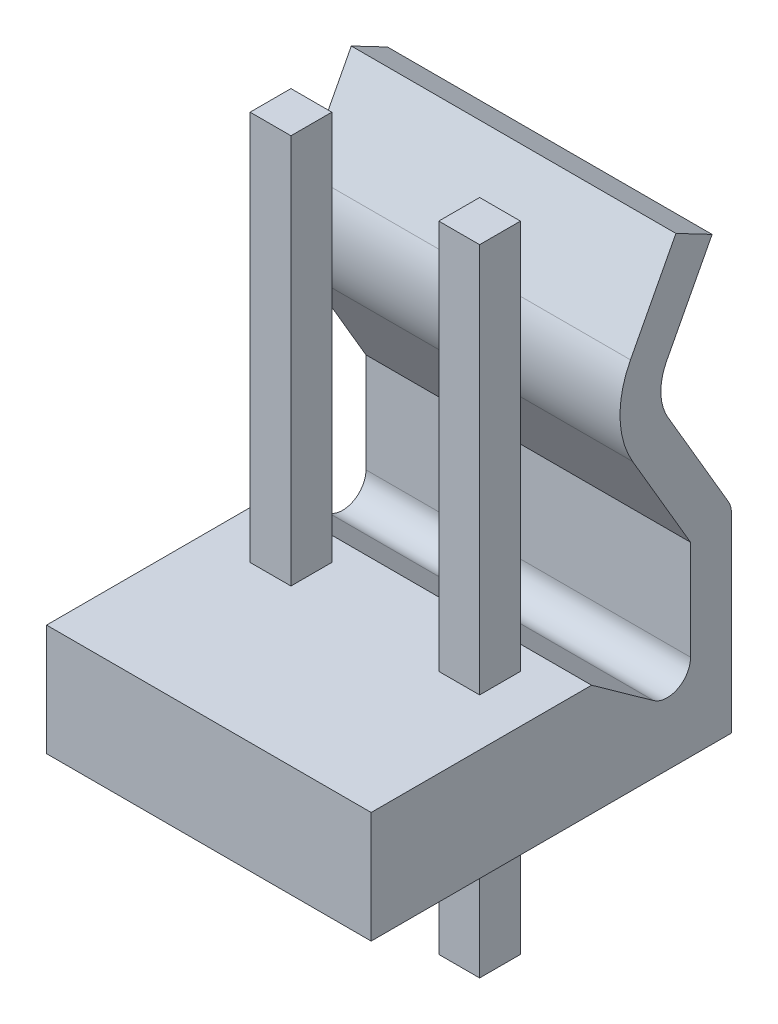
ISO-10303-21;
HEADER;
FILE_DESCRIPTION(('STEP AP214'),'2;1');
FILE_NAME('part.step','',(''),(''),'','','');
FILE_SCHEMA(('AUTOMOTIVE_DESIGN { 1 0 10303 214 1 1 1 1 }'));
ENDSEC;
DATA;
#1=APPLICATION_CONTEXT('core data for automotive mechanical design processes');
#2=APPLICATION_PROTOCOL_DEFINITION('international standard','automotive_design',2000,#1);
#3=PRODUCT_CONTEXT('',#1,'mechanical');
#4=PRODUCT('Part','Part','',(#3));
#5=PRODUCT_RELATED_PRODUCT_CATEGORY('part','',(#4));
#6=PRODUCT_DEFINITION_FORMATION('','',#4);
#7=PRODUCT_DEFINITION_CONTEXT('part definition',#1,'design');
#8=PRODUCT_DEFINITION('design','',#6,#7);
#9=PRODUCT_DEFINITION_SHAPE('','',#8);
#10=(LENGTH_UNIT() NAMED_UNIT(*) SI_UNIT(.MILLI.,.METRE.));
#11=(NAMED_UNIT(*) PLANE_ANGLE_UNIT() SI_UNIT($,.RADIAN.));
#12=(NAMED_UNIT(*) SI_UNIT($,.STERADIAN.) SOLID_ANGLE_UNIT());
#13=UNCERTAINTY_MEASURE_WITH_UNIT(LENGTH_MEASURE(1.E-05),#10,'distance_accuracy_value','');
#14=(GEOMETRIC_REPRESENTATION_CONTEXT(3) GLOBAL_UNCERTAINTY_ASSIGNED_CONTEXT((#13)) GLOBAL_UNIT_ASSIGNED_CONTEXT((#10,
#11,#12)) REPRESENTATION_CONTEXT('',''));
#15=CARTESIAN_POINT('',(0.,0.,0.));
#16=DIRECTION('',(0.,0.,1.));
#17=DIRECTION('',(1.,0.,0.));
#18=AXIS2_PLACEMENT_3D('',#15,#16,#17);
#19=CARTESIAN_POINT('',(-1.83,3.,4.75));
#20=DIRECTION('',(1.,0.,0.));
#21=DIRECTION('',(0.,0.,-1.));
#22=AXIS2_PLACEMENT_3D('',#19,#20,#21);
#23=PLANE('',#22);
#24=CARTESIAN_POINT('',(-1.83,8.91550890004947,-4.42538276181376));
#25=DIRECTION('',(-1.,0.,0.));
#26=DIRECTION('',(0.,0.,1.));
#27=AXIS2_PLACEMENT_3D('',#24,#25,#26);
#28=CIRCLE('',#27,2.47538276181376);
#29=CARTESIAN_POINT('',(-1.83,7.66445370084309,-2.28940975027466));
#30=VERTEX_POINT('',#29);
#31=CARTESIAN_POINT('',(-1.83,10.0634674155817,-2.23227741457167));
#32=VERTEX_POINT('',#31);
#33=EDGE_CURVE('E466',#30,#32,#28,.T.);
#34=ORIENTED_EDGE('',*,*,#33,.T.);
#35=DIRECTION('',(0.,-0.885966154840295,0.463749902940694));
#36=VECTOR('',#35,1.);
#37=CARTESIAN_POINT('',(-1.83,1.24712078359708,2.38254886579722));
#38=LINE('',#37,#36);
#39=CARTESIAN_POINT('',(-1.83,12.4,-3.45531144733007));
#40=VERTEX_POINT('',#39);
#41=EDGE_CURVE('E428',#40,#32,#38,.T.);
#42=ORIENTED_EDGE('',*,*,#41,.F.);
#43=DIRECTION('',(0.,-0.463749902940693,-0.885966154840295));
#44=VECTOR('',#43,1.);
#45=CARTESIAN_POINT('',(-1.83,11.1528792164029,-5.83786031312728));
#46=LINE('',#45,#44);
#47=CARTESIAN_POINT('',(-1.83,11.8898751067652,-4.42987421765439));
#48=VERTEX_POINT('',#47);
#49=EDGE_CURVE('E460',#40,#48,#46,.T.);
#50=ORIENTED_EDGE('',*,*,#49,.T.);
#51=DIRECTION('',(0.,-0.885966154840295,0.463749902940694));
#52=VECTOR('',#51,1.);
#53=CARTESIAN_POINT('',(-1.83,0.736995890362313,1.40798609547289));
#54=LINE('',#53,#52);
#55=CARTESIAN_POINT('',(-1.83,9.5533425223469,-3.206840184896));
#56=VERTEX_POINT('',#55);
#57=EDGE_CURVE('E457',#48,#56,#54,.T.);
#58=ORIENTED_EDGE('',*,*,#57,.T.);
#59=CARTESIAN_POINT('',(-1.83,8.91550890004947,-4.42538276181376));
#60=DIRECTION('',(-1.,0.,0.));
#61=DIRECTION('',(0.,0.,1.));
#62=AXIS2_PLACEMENT_3D('',#59,#60,#61);
#63=CIRCLE('',#62,1.37538276181376);
#64=CARTESIAN_POINT('',(-1.83,8.22039225723777,-3.23858429771775));
#65=VERTEX_POINT('',#64);
#66=EDGE_CURVE('E454',#65,#56,#63,.T.);
#67=ORIENTED_EDGE('',*,*,#66,.F.);
#68=DIRECTION('',(0.,-0.862885952220996,-0.505398687631523));
#69=VECTOR('',#68,1.);
#70=CARTESIAN_POINT('',(-1.83,3.51206822083145,-5.99628452776422));
#71=LINE('',#70,#69);
#72=CARTESIAN_POINT('',(-1.83,5.4429665684072,-4.86534307680788));
#73=VERTEX_POINT('',#72);
#74=EDGE_CURVE('E451',#65,#73,#71,.T.);
#75=ORIENTED_EDGE('',*,*,#74,.T.);
#76=CARTESIAN_POINT('',(-1.83,5.13092342933234,-4.33258023475049));
#77=DIRECTION('',(-1.,0.,0.));
#78=DIRECTION('',(0.,0.,1.));
#79=AXIS2_PLACEMENT_3D('',#76,#77,#78);
#80=CIRCLE('',#79,0.617419765249505);
#81=CARTESIAN_POINT('',(-1.83,5.13092342933234,-4.95));
#82=VERTEX_POINT('',#81);
#83=EDGE_CURVE('E448',#73,#82,#80,.T.);
#84=ORIENTED_EDGE('',*,*,#83,.T.);
#85=DIRECTION('',(0.,-1.,0.));
#86=VECTOR('',#85,1.);
#87=CARTESIAN_POINT('',(-1.83,3.,-4.95));
#88=LINE('',#87,#86);
#89=CARTESIAN_POINT('',(-1.83,0.,-4.95));
#90=VERTEX_POINT('',#89);
#91=EDGE_CURVE('E552',#82,#90,#88,.T.);
#92=ORIENTED_EDGE('',*,*,#91,.T.);
#93=DIRECTION('',(0.,0.,1.));
#94=VECTOR('',#93,1.);
#95=CARTESIAN_POINT('',(-1.83,0.,4.75));
#96=LINE('',#95,#94);
#97=CARTESIAN_POINT('',(-1.83,0.,4.75));
#98=VERTEX_POINT('',#97);
#99=EDGE_CURVE('E533',#90,#98,#96,.T.);
#100=ORIENTED_EDGE('',*,*,#99,.T.);
#101=DIRECTION('',(0.,-1.,0.));
#102=VECTOR('',#101,1.);
#103=CARTESIAN_POINT('',(-1.83,3.,4.75));
#104=LINE('',#103,#102);
#105=CARTESIAN_POINT('',(-1.83,3.,4.75));
#106=VERTEX_POINT('',#105);
#107=EDGE_CURVE('E568',#106,#98,#104,.T.);
#108=ORIENTED_EDGE('',*,*,#107,.F.);
#109=DIRECTION('',(0.,0.,1.));
#110=VECTOR('',#109,1.);
#111=CARTESIAN_POINT('',(-1.83,3.,4.75));
#112=LINE('',#111,#110);
#113=CARTESIAN_POINT('',(-1.83,3.,-1.18444451529598));
#114=VERTEX_POINT('',#113);
#115=EDGE_CURVE('E544',#114,#106,#112,.T.);
#116=ORIENTED_EDGE('',*,*,#115,.F.);
#117=DIRECTION('',(0.,-0.581152715503747,-0.813794520295278));
#118=VECTOR('',#117,1.);
#119=CARTESIAN_POINT('',(-1.83,2.5469544444336,-1.8188491747399));
#120=LINE('',#119,#118);
#121=CARTESIAN_POINT('',(-1.83,1.80749793323204,-2.85431823607068));
#122=VERTEX_POINT('',#121);
#123=EDGE_CURVE('E484',#114,#122,#120,.T.);
#124=ORIENTED_EDGE('',*,*,#123,.T.);
#125=CARTESIAN_POINT('',(-1.83,2.31995973119661,-3.2202810903929));
#126=DIRECTION('',(-1.,0.,0.));
#127=DIRECTION('',(0.,0.,1.));
#128=AXIS2_PLACEMENT_3D('',#125,#126,#127);
#129=CIRCLE('',#128,0.629718909607097);
#130=CARTESIAN_POINT('',(-1.83,2.31995973119661,-3.85));
#131=VERTEX_POINT('',#130);
#132=EDGE_CURVE('E481',#131,#122,#129,.T.);
#133=ORIENTED_EDGE('',*,*,#132,.F.);
#134=DIRECTION('',(0.,1.,0.));
#135=VECTOR('',#134,1.);
#136=CARTESIAN_POINT('',(-1.83,0.,-3.85));
#137=LINE('',#136,#135);
#138=CARTESIAN_POINT('',(-1.83,5.,-3.85));
#139=VERTEX_POINT('',#138);
#140=EDGE_CURVE('E478',#131,#139,#137,.T.);
#141=ORIENTED_EDGE('',*,*,#140,.T.);
#142=DIRECTION('',(0.,0.862885952220995,0.505398687631523));
#143=VECTOR('',#142,1.);
#144=CARTESIAN_POINT('',(-1.83,2.95612966443678,-5.04710998032113));
#145=LINE('',#144,#143);
#146=EDGE_CURVE('E475',#139,#30,#145,.T.);
#147=ORIENTED_EDGE('',*,*,#146,.T.);
#148=EDGE_LOOP('',(#34,#42,#50,#58,#67,#75,#84,#92,#100,#108,#116,#124,#133,#141,#147));
#149=FACE_BOUND('',#148,.T.);
#150=ADVANCED_FACE('F146',(#149),#23,.F.);
#151=CARTESIAN_POINT('',(6.91,3.,-4.95));
#152=DIRECTION('',(-1.,0.,0.));
#153=DIRECTION('',(0.,0.,1.));
#154=AXIS2_PLACEMENT_3D('',#151,#152,#153);
#155=PLANE('',#154);
#156=DIRECTION('',(0.,-0.885966154840295,0.463749902940694));
#157=VECTOR('',#156,1.);
#158=CARTESIAN_POINT('',(6.91,5.63571912182841,0.085382047085799));
#159=LINE('',#158,#157);
#160=CARTESIAN_POINT('',(6.91,12.4,-3.45531144733007));
#161=VERTEX_POINT('',#160);
#162=CARTESIAN_POINT('',(6.91,10.0634674155817,-2.23227741457167));
#163=VERTEX_POINT('',#162);
#164=EDGE_CURVE('E445',#161,#163,#159,.T.);
#165=ORIENTED_EDGE('',*,*,#164,.T.);
#166=CARTESIAN_POINT('',(6.91,8.91550890004947,-4.42538276181376));
#167=DIRECTION('',(-1.,0.,0.));
#168=DIRECTION('',(0.,0.,1.));
#169=AXIS2_PLACEMENT_3D('',#166,#167,#168);
#170=CIRCLE('',#169,2.47538276181376);
#171=CARTESIAN_POINT('',(6.91,7.66445370084309,-2.28940975027466));
#172=VERTEX_POINT('',#171);
#173=EDGE_CURVE('E500',#172,#163,#170,.T.);
#174=ORIENTED_EDGE('',*,*,#173,.F.);
#175=DIRECTION('',(0.,0.862885952220995,0.505398687631523));
#176=VECTOR('',#175,1.);
#177=CARTESIAN_POINT('',(6.91,3.03114409630835,-5.00317347246197));
#178=LINE('',#177,#176);
#179=CARTESIAN_POINT('',(6.91,5.,-3.85));
#180=VERTEX_POINT('',#179);
#181=EDGE_CURVE('E573',#180,#172,#178,.T.);
#182=ORIENTED_EDGE('',*,*,#181,.F.);
#183=DIRECTION('',(0.,1.,0.));
#184=VECTOR('',#183,1.);
#185=CARTESIAN_POINT('',(6.91,3.,-3.85));
#186=LINE('',#185,#184);
#187=CARTESIAN_POINT('',(6.91,2.31995973119661,-3.85));
#188=VERTEX_POINT('',#187);
#189=EDGE_CURVE('E575',#188,#180,#186,.T.);
#190=ORIENTED_EDGE('',*,*,#189,.F.);
#191=CARTESIAN_POINT('',(6.91,2.31995973119661,-3.2202810903929));
#192=DIRECTION('',(-1.,0.,0.));
#193=DIRECTION('',(0.,0.,1.));
#194=AXIS2_PLACEMENT_3D('',#191,#192,#193);
#195=CIRCLE('',#194,0.629718909607097);
#196=CARTESIAN_POINT('',(6.91,1.80749793323204,-2.85431823607068));
#197=VERTEX_POINT('',#196);
#198=EDGE_CURVE('E577',#188,#197,#195,.T.);
#199=ORIENTED_EDGE('',*,*,#198,.T.);
#200=DIRECTION('',(0.,-0.581152715503746,-0.813794520295278));
#201=VECTOR('',#200,1.);
#202=CARTESIAN_POINT('',(6.91,1.21912234875397,-3.67822701899487));
#203=LINE('',#202,#201);
#204=CARTESIAN_POINT('',(6.91,3.,-1.18444451529598));
#205=VERTEX_POINT('',#204);
#206=EDGE_CURVE('E580',#205,#197,#203,.T.);
#207=ORIENTED_EDGE('',*,*,#206,.F.);
#208=DIRECTION('',(0.,0.,-1.));
#209=VECTOR('',#208,1.);
#210=CARTESIAN_POINT('',(6.91,3.,-4.95));
#211=LINE('',#210,#209);
#212=CARTESIAN_POINT('',(6.91,3.,4.75));
#213=VERTEX_POINT('',#212);
#214=EDGE_CURVE('E549',#213,#205,#211,.T.);
#215=ORIENTED_EDGE('',*,*,#214,.F.);
#216=DIRECTION('',(0.,-1.,0.));
#217=VECTOR('',#216,1.);
#218=CARTESIAN_POINT('',(6.91,3.,4.75));
#219=LINE('',#218,#217);
#220=CARTESIAN_POINT('',(6.91,0.,4.75));
#221=VERTEX_POINT('',#220);
#222=EDGE_CURVE('E565',#213,#221,#219,.T.);
#223=ORIENTED_EDGE('',*,*,#222,.T.);
#224=DIRECTION('',(0.,0.,-1.));
#225=VECTOR('',#224,1.);
#226=CARTESIAN_POINT('',(6.91,0.,-4.95));
#227=LINE('',#226,#225);
#228=CARTESIAN_POINT('',(6.91,0.,-4.95));
#229=VERTEX_POINT('',#228);
#230=EDGE_CURVE('E557',#221,#229,#227,.T.);
#231=ORIENTED_EDGE('',*,*,#230,.T.);
#232=DIRECTION('',(0.,-1.,0.));
#233=VECTOR('',#232,1.);
#234=CARTESIAN_POINT('',(6.91,3.,-4.95));
#235=LINE('',#234,#233);
#236=CARTESIAN_POINT('',(6.91,5.13092342933234,-4.95));
#237=VERTEX_POINT('',#236);
#238=EDGE_CURVE('E563',#237,#229,#235,.T.);
#239=ORIENTED_EDGE('',*,*,#238,.F.);
#240=CARTESIAN_POINT('',(6.91,5.13092342933234,-4.33258023475049));
#241=DIRECTION('',(-1.,0.,0.));
#242=DIRECTION('',(0.,0.,1.));
#243=AXIS2_PLACEMENT_3D('',#240,#241,#242);
#244=CIRCLE('',#243,0.617419765249505);
#245=CARTESIAN_POINT('',(6.91,5.4429665684072,-4.86534307680788));
#246=VERTEX_POINT('',#245);
#247=EDGE_CURVE('E502',#246,#237,#244,.T.);
#248=ORIENTED_EDGE('',*,*,#247,.F.);
#249=DIRECTION('',(0.,-0.862885952220996,-0.505398687631523));
#250=VECTOR('',#249,1.);
#251=CARTESIAN_POINT('',(6.91,3.58708265270302,-5.95234801990506));
#252=LINE('',#251,#250);
#253=CARTESIAN_POINT('',(6.91,8.22039225723777,-3.23858429771775));
#254=VERTEX_POINT('',#253);
#255=EDGE_CURVE('E582',#254,#246,#252,.T.);
#256=ORIENTED_EDGE('',*,*,#255,.F.);
#257=CARTESIAN_POINT('',(6.91,8.91550890004947,-4.42538276181376));
#258=DIRECTION('',(-1.,0.,0.));
#259=DIRECTION('',(0.,0.,1.));
#260=AXIS2_PLACEMENT_3D('',#257,#258,#259);
#261=CIRCLE('',#260,1.37538276181376);
#262=CARTESIAN_POINT('',(6.91,9.5533425223469,-3.206840184896));
#263=VERTEX_POINT('',#262);
#264=EDGE_CURVE('E153',#254,#263,#261,.T.);
#265=ORIENTED_EDGE('',*,*,#264,.T.);
#266=DIRECTION('',(0.,-0.885966154840295,0.463749902940694));
#267=VECTOR('',#266,1.);
#268=CARTESIAN_POINT('',(6.91,5.12559422859364,-0.889180723238528));
#269=LINE('',#268,#267);
#270=CARTESIAN_POINT('',(6.91,11.8898751067652,-4.42987421765439));
#271=VERTEX_POINT('',#270);
#272=EDGE_CURVE('E12',#271,#263,#269,.T.);
#273=ORIENTED_EDGE('',*,*,#272,.F.);
#274=DIRECTION('',(0.,-0.463749902940693,-0.885966154840295));
#275=VECTOR('',#274,1.);
#276=CARTESIAN_POINT('',(6.91,9.7642808781716,-8.49069349441586));
#277=LINE('',#276,#275);
#278=EDGE_CURVE('E491',#161,#271,#277,.T.);
#279=ORIENTED_EDGE('',*,*,#278,.F.);
#280=EDGE_LOOP('',(#165,#174,#182,#190,#199,#207,#215,#223,#231,#239,#248,#256,#265,#273,#279));
#281=FACE_BOUND('',#280,.T.);
#282=ADVANCED_FACE('F587',(#281),#155,.F.);
#283=CARTESIAN_POINT('',(0.,3.,0.));
#284=DIRECTION('',(0.,-1.,0.));
#285=DIRECTION('',(0.,0.,-1.));
#286=AXIS2_PLACEMENT_3D('',#283,#284,#285);
#287=PLANE('',#286);
#288=DIRECTION('',(0.,0.,-1.));
#289=VECTOR('',#288,1.);
#290=CARTESIAN_POINT('',(0.549999999999999,3.,0.550000000000001));
#291=LINE('',#290,#289);
#292=CARTESIAN_POINT('',(0.549999999999999,3.,0.550000000000001));
#293=VERTEX_POINT('',#292);
#294=CARTESIAN_POINT('',(0.549999999999993,3.,-0.549999999999999));
#295=VERTEX_POINT('',#294);
#296=EDGE_CURVE('E354',#293,#295,#291,.T.);
#297=ORIENTED_EDGE('',*,*,#296,.F.);
#298=DIRECTION('',(1.,0.,0.));
#299=VECTOR('',#298,1.);
#300=CARTESIAN_POINT('',(-0.550000000000001,3.,0.550000000000001));
#301=LINE('',#300,#299);
#302=CARTESIAN_POINT('',(-0.550000000000001,3.,0.550000000000001));
#303=VERTEX_POINT('',#302);
#304=EDGE_CURVE('E168',#303,#293,#301,.T.);
#305=ORIENTED_EDGE('',*,*,#304,.F.);
#306=DIRECTION('',(0.,0.,1.));
#307=VECTOR('',#306,1.);
#308=CARTESIAN_POINT('',(-0.550000000000001,3.,0.550000000000001));
#309=LINE('',#308,#307);
#310=CARTESIAN_POINT('',(-0.550000000000001,3.,-0.549999999999999));
#311=VERTEX_POINT('',#310);
#312=EDGE_CURVE('E530',#311,#303,#309,.T.);
#313=ORIENTED_EDGE('',*,*,#312,.F.);
#314=DIRECTION('',(-1.,0.,0.));
#315=VECTOR('',#314,1.);
#316=CARTESIAN_POINT('',(-0.550000000000001,3.,-0.549999999999999));
#317=LINE('',#316,#315);
#318=EDGE_CURVE('E527',#295,#311,#317,.T.);
#319=ORIENTED_EDGE('',*,*,#318,.F.);
#320=EDGE_LOOP('',(#297,#305,#313,#319));
#321=FACE_BOUND('',#320,.T.);
#322=DIRECTION('',(1.,0.,0.));
#323=VECTOR('',#322,1.);
#324=CARTESIAN_POINT('',(5.63,3.,0.550000000000001));
#325=LINE('',#324,#323);
#326=CARTESIAN_POINT('',(4.53,3.,0.550000000000001));
#327=VERTEX_POINT('',#326);
#328=CARTESIAN_POINT('',(5.63,3.,0.550000000000001));
#329=VERTEX_POINT('',#328);
#330=EDGE_CURVE('E505',#327,#329,#325,.T.);
#331=ORIENTED_EDGE('',*,*,#330,.F.);
#332=DIRECTION('',(0.,0.,1.));
#333=VECTOR('',#332,1.);
#334=CARTESIAN_POINT('',(4.53,3.,0.550000000000001));
#335=LINE('',#334,#333);
#336=CARTESIAN_POINT('',(4.53000000000001,3.,-0.549999999999999));
#337=VERTEX_POINT('',#336);
#338=EDGE_CURVE('E160',#337,#327,#335,.T.);
#339=ORIENTED_EDGE('',*,*,#338,.F.);
#340=DIRECTION('',(-1.,0.,0.));
#341=VECTOR('',#340,1.);
#342=CARTESIAN_POINT('',(5.63,3.,-0.549999999999999));
#343=LINE('',#342,#341);
#344=CARTESIAN_POINT('',(5.63,3.,-0.549999999999999));
#345=VERTEX_POINT('',#344);
#346=EDGE_CURVE('E512',#345,#337,#343,.T.);
#347=ORIENTED_EDGE('',*,*,#346,.F.);
#348=DIRECTION('',(0.,0.,-1.));
#349=VECTOR('',#348,1.);
#350=CARTESIAN_POINT('',(5.63,3.,0.550000000000001));
#351=LINE('',#350,#349);
#352=EDGE_CURVE('E508',#329,#345,#351,.T.);
#353=ORIENTED_EDGE('',*,*,#352,.F.);
#354=EDGE_LOOP('',(#331,#339,#347,#353));
#355=FACE_BOUND('',#354,.T.);
#356=DIRECTION('',(-1.,0.,0.));
#357=VECTOR('',#356,1.);
#358=CARTESIAN_POINT('',(7.17,3.,-1.18444451529598));
#359=LINE('',#358,#357);
#360=EDGE_CURVE('E488',#205,#114,#359,.T.);
#361=ORIENTED_EDGE('',*,*,#360,.T.);
#362=ORIENTED_EDGE('',*,*,#115,.T.);
#363=DIRECTION('',(1.,0.,0.));
#364=VECTOR('',#363,1.);
#365=CARTESIAN_POINT('',(6.91,3.,4.75));
#366=LINE('',#365,#364);
#367=EDGE_CURVE('E546',#106,#213,#366,.T.);
#368=ORIENTED_EDGE('',*,*,#367,.T.);
#369=ORIENTED_EDGE('',*,*,#214,.T.);
#370=EDGE_LOOP('',(#361,#362,#368,#369));
#371=FACE_BOUND('',#370,.T.);
#372=ADVANCED_FACE('F637',(#321,#355,#371),#287,.F.);
#373=CARTESIAN_POINT('',(-1.83,3.,-4.95));
#374=DIRECTION('',(0.,0.,1.));
#375=DIRECTION('',(1.,0.,0.));
#376=AXIS2_PLACEMENT_3D('',#373,#374,#375);
#377=PLANE('',#376);
#378=DIRECTION('',(-1.,0.,0.));
#379=VECTOR('',#378,1.);
#380=CARTESIAN_POINT('',(7.17,5.13092342933234,-4.95));
#381=LINE('',#380,#379);
#382=EDGE_CURVE('E464',#237,#82,#381,.T.);
#383=ORIENTED_EDGE('',*,*,#382,.F.);
#384=ORIENTED_EDGE('',*,*,#238,.T.);
#385=DIRECTION('',(-1.,0.,0.));
#386=VECTOR('',#385,1.);
#387=CARTESIAN_POINT('',(-1.83,0.,-4.95));
#388=LINE('',#387,#386);
#389=EDGE_CURVE('E547',#229,#90,#388,.T.);
#390=ORIENTED_EDGE('',*,*,#389,.T.);
#391=ORIENTED_EDGE('',*,*,#91,.F.);
#392=EDGE_LOOP('',(#383,#384,#390,#391));
#393=FACE_BOUND('',#392,.T.);
#394=ADVANCED_FACE('F654',(#393),#377,.F.);
#395=CARTESIAN_POINT('',(0.,0.,0.));
#396=DIRECTION('',(0.,-1.,0.));
#397=DIRECTION('',(0.,0.,-1.));
#398=AXIS2_PLACEMENT_3D('',#395,#396,#397);
#399=PLANE('',#398);
#400=ORIENTED_EDGE('',*,*,#99,.F.);
#401=ORIENTED_EDGE('',*,*,#389,.F.);
#402=ORIENTED_EDGE('',*,*,#230,.F.);
#403=DIRECTION('',(1.,0.,0.));
#404=VECTOR('',#403,1.);
#405=CARTESIAN_POINT('',(6.91,0.,4.75));
#406=LINE('',#405,#404);
#407=EDGE_CURVE('E555',#98,#221,#406,.T.);
#408=ORIENTED_EDGE('',*,*,#407,.F.);
#409=EDGE_LOOP('',(#400,#401,#402,#408));
#410=FACE_BOUND('',#409,.T.);
#411=DIRECTION('',(1.,0.,0.));
#412=VECTOR('',#411,1.);
#413=CARTESIAN_POINT('',(-0.550000000000001,0.,0.550000000000001));
#414=LINE('',#413,#412);
#415=CARTESIAN_POINT('',(-0.550000000000001,0.,0.550000000000001));
#416=VERTEX_POINT('',#415);
#417=CARTESIAN_POINT('',(0.549999999999999,0.,0.550000000000001));
#418=VERTEX_POINT('',#417);
#419=EDGE_CURVE('E528',#416,#418,#414,.T.);
#420=ORIENTED_EDGE('',*,*,#419,.T.);
#421=DIRECTION('',(0.,0.,-1.));
#422=VECTOR('',#421,1.);
#423=CARTESIAN_POINT('',(0.549999999999999,0.,0.550000000000001));
#424=LINE('',#423,#422);
#425=CARTESIAN_POINT('',(0.549999999999993,0.,-0.549999999999999));
#426=VERTEX_POINT('',#425);
#427=EDGE_CURVE('E515',#418,#426,#424,.T.);
#428=ORIENTED_EDGE('',*,*,#427,.T.);
#429=DIRECTION('',(-1.,0.,0.));
#430=VECTOR('',#429,1.);
#431=CARTESIAN_POINT('',(-0.550000000000001,0.,-0.549999999999999));
#432=LINE('',#431,#430);
#433=CARTESIAN_POINT('',(-0.550000000000001,0.,-0.549999999999999));
#434=VERTEX_POINT('',#433);
#435=EDGE_CURVE('E536',#426,#434,#432,.T.);
#436=ORIENTED_EDGE('',*,*,#435,.T.);
#437=DIRECTION('',(0.,0.,1.));
#438=VECTOR('',#437,1.);
#439=CARTESIAN_POINT('',(-0.550000000000001,0.,0.550000000000001));
#440=LINE('',#439,#438);
#441=EDGE_CURVE('E539',#434,#416,#440,.T.);
#442=ORIENTED_EDGE('',*,*,#441,.T.);
#443=EDGE_LOOP('',(#420,#428,#436,#442));
#444=FACE_BOUND('',#443,.T.);
#445=DIRECTION('',(0.,0.,1.));
#446=VECTOR('',#445,1.);
#447=CARTESIAN_POINT('',(4.53,0.,0.550000000000001));
#448=LINE('',#447,#446);
#449=CARTESIAN_POINT('',(4.53,0.,-0.549999999999999));
#450=VERTEX_POINT('',#449);
#451=CARTESIAN_POINT('',(4.53,0.,0.550000000000001));
#452=VERTEX_POINT('',#451);
#453=EDGE_CURVE('E509',#450,#452,#448,.T.);
#454=ORIENTED_EDGE('',*,*,#453,.T.);
#455=DIRECTION('',(1.,0.,0.));
#456=VECTOR('',#455,1.);
#457=CARTESIAN_POINT('',(5.63,0.,0.550000000000001));
#458=LINE('',#457,#456);
#459=CARTESIAN_POINT('',(5.63,0.,0.550000000000001));
#460=VERTEX_POINT('',#459);
#461=EDGE_CURVE('E504',#452,#460,#458,.T.);
#462=ORIENTED_EDGE('',*,*,#461,.T.);
#463=DIRECTION('',(0.,0.,-1.));
#464=VECTOR('',#463,1.);
#465=CARTESIAN_POINT('',(5.63,0.,0.550000000000001));
#466=LINE('',#465,#464);
#467=CARTESIAN_POINT('',(5.63,0.,-0.549999999999999));
#468=VERTEX_POINT('',#467);
#469=EDGE_CURVE('E518',#460,#468,#466,.T.);
#470=ORIENTED_EDGE('',*,*,#469,.T.);
#471=DIRECTION('',(-1.,0.,0.));
#472=VECTOR('',#471,1.);
#473=CARTESIAN_POINT('',(5.63,0.,-0.549999999999999));
#474=LINE('',#473,#472);
#475=EDGE_CURVE('E521',#468,#450,#474,.T.);
#476=ORIENTED_EDGE('',*,*,#475,.T.);
#477=EDGE_LOOP('',(#454,#462,#470,#476));
#478=FACE_BOUND('',#477,.T.);
#479=ADVANCED_FACE('F649',(#410,#444,#478),#399,.T.);
#480=CARTESIAN_POINT('',(6.91,3.,4.75));
#481=DIRECTION('',(0.,0.,-1.));
#482=DIRECTION('',(-1.,0.,0.));
#483=AXIS2_PLACEMENT_3D('',#480,#481,#482);
#484=PLANE('',#483);
#485=ORIENTED_EDGE('',*,*,#407,.T.);
#486=ORIENTED_EDGE('',*,*,#222,.F.);
#487=ORIENTED_EDGE('',*,*,#367,.F.);
#488=ORIENTED_EDGE('',*,*,#107,.T.);
#489=EDGE_LOOP('',(#485,#486,#487,#488));
#490=FACE_BOUND('',#489,.T.);
#491=ADVANCED_FACE('F643',(#490),#484,.F.);
#492=CARTESIAN_POINT('',(7.17,0.736995890362313,1.40798609547289));
#493=DIRECTION('',(0.,-0.463749902940694,-0.885966154840295));
#494=DIRECTION('',(0.,0.885966154840295,-0.463749902940694));
#495=AXIS2_PLACEMENT_3D('',#492,#493,#494);
#496=PLANE('',#495);
#497=ORIENTED_EDGE('',*,*,#272,.T.);
#498=DIRECTION('',(-1.,0.,0.));
#499=VECTOR('',#498,1.);
#500=CARTESIAN_POINT('',(7.17,9.5533425223469,-3.206840184896));
#501=LINE('',#500,#499);
#502=EDGE_CURVE('E469',#263,#56,#501,.T.);
#503=ORIENTED_EDGE('',*,*,#502,.T.);
#504=ORIENTED_EDGE('',*,*,#57,.F.);
#505=DIRECTION('',(-1.,0.,0.));
#506=VECTOR('',#505,1.);
#507=CARTESIAN_POINT('',(7.17,11.8898751067652,-4.42987421765439));
#508=LINE('',#507,#506);
#509=EDGE_CURVE('E467',#271,#48,#508,.T.);
#510=ORIENTED_EDGE('',*,*,#509,.F.);
#511=EDGE_LOOP('',(#497,#503,#504,#510));
#512=FACE_BOUND('',#511,.T.);
#513=ADVANCED_FACE('F606',(#512),#496,.T.);
#514=CARTESIAN_POINT('',(7.17,8.91550890004947,-4.42538276181376));
#515=DIRECTION('',(-1.,0.,0.));
#516=DIRECTION('',(0.,0.,1.));
#517=AXIS2_PLACEMENT_3D('',#514,#515,#516);
#518=CYLINDRICAL_SURFACE('',#517,1.37538276181376);
#519=DIRECTION('',(-1.,0.,0.));
#520=VECTOR('',#519,1.);
#521=CARTESIAN_POINT('',(7.17,8.22039225723777,-3.23858429771775));
#522=LINE('',#521,#520);
#523=EDGE_CURVE('E471',#254,#65,#522,.T.);
#524=ORIENTED_EDGE('',*,*,#523,.T.);
#525=ORIENTED_EDGE('',*,*,#66,.T.);
#526=ORIENTED_EDGE('',*,*,#502,.F.);
#527=ORIENTED_EDGE('',*,*,#264,.F.);
#528=EDGE_LOOP('',(#524,#525,#526,#527));
#529=FACE_BOUND('',#528,.T.);
#530=ADVANCED_FACE('F593',(#529),#518,.F.);
#531=CARTESIAN_POINT('',(7.17,3.51206822083145,-5.99628452776422));
#532=DIRECTION('',(0.,0.505398687631523,-0.862885952220996));
#533=DIRECTION('',(0.,0.862885952220996,0.505398687631523));
#534=AXIS2_PLACEMENT_3D('',#531,#532,#533);
#535=PLANE('',#534);
#536=ORIENTED_EDGE('',*,*,#255,.T.);
#537=DIRECTION('',(-1.,0.,0.));
#538=VECTOR('',#537,1.);
#539=CARTESIAN_POINT('',(7.17,5.4429665684072,-4.86534307680788));
#540=LINE('',#539,#538);
#541=EDGE_CURVE('E463',#246,#73,#540,.T.);
#542=ORIENTED_EDGE('',*,*,#541,.T.);
#543=ORIENTED_EDGE('',*,*,#74,.F.);
#544=ORIENTED_EDGE('',*,*,#523,.F.);
#545=EDGE_LOOP('',(#536,#542,#543,#544));
#546=FACE_BOUND('',#545,.T.);
#547=ADVANCED_FACE('F596',(#546),#535,.T.);
#548=CARTESIAN_POINT('',(7.17,5.13092342933234,-4.33258023475049));
#549=DIRECTION('',(-1.,0.,0.));
#550=DIRECTION('',(0.,0.,1.));
#551=AXIS2_PLACEMENT_3D('',#548,#549,#550);
#552=CYLINDRICAL_SURFACE('',#551,0.617419765249505);
#553=ORIENTED_EDGE('',*,*,#247,.T.);
#554=ORIENTED_EDGE('',*,*,#382,.T.);
#555=ORIENTED_EDGE('',*,*,#83,.F.);
#556=ORIENTED_EDGE('',*,*,#541,.F.);
#557=EDGE_LOOP('',(#553,#554,#555,#556));
#558=FACE_BOUND('',#557,.T.);
#559=ADVANCED_FACE('F656',(#558),#552,.T.);
#560=CARTESIAN_POINT('',(7.17,11.1528792164029,-5.83786031312728));
#561=DIRECTION('',(0.,0.885966154840295,-0.463749902940693));
#562=DIRECTION('',(0.,0.463749902940693,0.885966154840295));
#563=AXIS2_PLACEMENT_3D('',#560,#561,#562);
#564=PLANE('',#563);
#565=ORIENTED_EDGE('',*,*,#278,.T.);
#566=ORIENTED_EDGE('',*,*,#509,.T.);
#567=ORIENTED_EDGE('',*,*,#49,.F.);
#568=DIRECTION('',(-1.,0.,0.));
#569=VECTOR('',#568,1.);
#570=CARTESIAN_POINT('',(0.,12.4,-3.45531144733007));
#571=LINE('',#570,#569);
#572=EDGE_CURVE('E571',#161,#40,#571,.T.);
#573=ORIENTED_EDGE('',*,*,#572,.F.);
#574=EDGE_LOOP('',(#565,#566,#567,#573));
#575=FACE_BOUND('',#574,.T.);
#576=ADVANCED_FACE('F608',(#575),#564,.T.);
#577=CARTESIAN_POINT('',(7.17,2.5469544444336,-1.8188491747399));
#578=DIRECTION('',(0.,0.813794520295278,-0.581152715503746));
#579=DIRECTION('',(0.,0.581152715503746,0.813794520295278));
#580=AXIS2_PLACEMENT_3D('',#577,#578,#579);
#581=PLANE('',#580);
#582=ORIENTED_EDGE('',*,*,#206,.T.);
#583=DIRECTION('',(-1.,0.,0.));
#584=VECTOR('',#583,1.);
#585=CARTESIAN_POINT('',(7.17,1.80749793323204,-2.85431823607068));
#586=LINE('',#585,#584);
#587=EDGE_CURVE('E492',#197,#122,#586,.T.);
#588=ORIENTED_EDGE('',*,*,#587,.T.);
#589=ORIENTED_EDGE('',*,*,#123,.F.);
#590=ORIENTED_EDGE('',*,*,#360,.F.);
#591=EDGE_LOOP('',(#582,#588,#589,#590));
#592=FACE_BOUND('',#591,.T.);
#593=ADVANCED_FACE('F634',(#592),#581,.T.);
#594=CARTESIAN_POINT('',(7.17,2.31995973119661,-3.2202810903929));
#595=DIRECTION('',(-1.,0.,0.));
#596=DIRECTION('',(0.,0.,1.));
#597=AXIS2_PLACEMENT_3D('',#594,#595,#596);
#598=CYLINDRICAL_SURFACE('',#597,0.629718909607097);
#599=DIRECTION('',(-1.,0.,0.));
#600=VECTOR('',#599,1.);
#601=CARTESIAN_POINT('',(7.17,2.31995973119661,-3.85));
#602=LINE('',#601,#600);
#603=EDGE_CURVE('E494',#188,#131,#602,.T.);
#604=ORIENTED_EDGE('',*,*,#603,.T.);
#605=ORIENTED_EDGE('',*,*,#132,.T.);
#606=ORIENTED_EDGE('',*,*,#587,.F.);
#607=ORIENTED_EDGE('',*,*,#198,.F.);
#608=EDGE_LOOP('',(#604,#605,#606,#607));
#609=FACE_BOUND('',#608,.T.);
#610=ADVANCED_FACE('F631',(#609),#598,.F.);
#611=CARTESIAN_POINT('',(7.17,0.,-3.85));
#612=DIRECTION('',(0.,0.,1.));
#613=DIRECTION('',(1.,0.,0.));
#614=AXIS2_PLACEMENT_3D('',#611,#612,#613);
#615=PLANE('',#614);
#616=ORIENTED_EDGE('',*,*,#189,.T.);
#617=DIRECTION('',(-1.,0.,0.));
#618=VECTOR('',#617,1.);
#619=CARTESIAN_POINT('',(7.17,5.,-3.85));
#620=LINE('',#619,#618);
#621=EDGE_CURVE('E496',#180,#139,#620,.T.);
#622=ORIENTED_EDGE('',*,*,#621,.T.);
#623=ORIENTED_EDGE('',*,*,#140,.F.);
#624=ORIENTED_EDGE('',*,*,#603,.F.);
#625=EDGE_LOOP('',(#616,#622,#623,#624));
#626=FACE_BOUND('',#625,.T.);
#627=ADVANCED_FACE('F627',(#626),#615,.T.);
#628=CARTESIAN_POINT('',(7.17,2.95612966443678,-5.04710998032113));
#629=DIRECTION('',(0.,-0.505398687631523,0.862885952220995));
#630=DIRECTION('',(0.,-0.862885952220995,-0.505398687631523));
#631=AXIS2_PLACEMENT_3D('',#628,#629,#630);
#632=PLANE('',#631);
#633=ORIENTED_EDGE('',*,*,#181,.T.);
#634=DIRECTION('',(-1.,0.,0.));
#635=VECTOR('',#634,1.);
#636=CARTESIAN_POINT('',(7.17,7.66445370084309,-2.28940975027466));
#637=LINE('',#636,#635);
#638=EDGE_CURVE('E487',#172,#30,#637,.T.);
#639=ORIENTED_EDGE('',*,*,#638,.T.);
#640=ORIENTED_EDGE('',*,*,#146,.F.);
#641=ORIENTED_EDGE('',*,*,#621,.F.);
#642=EDGE_LOOP('',(#633,#639,#640,#641));
#643=FACE_BOUND('',#642,.T.);
#644=ADVANCED_FACE('F621',(#643),#632,.T.);
#645=CARTESIAN_POINT('',(7.17,8.91550890004947,-4.42538276181376));
#646=DIRECTION('',(-1.,0.,0.));
#647=DIRECTION('',(0.,0.,1.));
#648=AXIS2_PLACEMENT_3D('',#645,#646,#647);
#649=CYLINDRICAL_SURFACE('',#648,2.47538276181376);
#650=ORIENTED_EDGE('',*,*,#173,.T.);
#651=DIRECTION('',(-1.,0.,0.));
#652=VECTOR('',#651,1.);
#653=CARTESIAN_POINT('',(7.17,10.0634674155817,-2.23227741457167));
#654=LINE('',#653,#652);
#655=EDGE_CURVE('E442',#163,#32,#654,.T.);
#656=ORIENTED_EDGE('',*,*,#655,.T.);
#657=ORIENTED_EDGE('',*,*,#33,.F.);
#658=ORIENTED_EDGE('',*,*,#638,.F.);
#659=EDGE_LOOP('',(#650,#656,#657,#658));
#660=FACE_BOUND('',#659,.T.);
#661=ADVANCED_FACE('F617',(#660),#649,.T.);
#662=CARTESIAN_POINT('',(7.17,1.24712078359708,2.38254886579722));
#663=DIRECTION('',(0.,-0.463749902940694,-0.885966154840295));
#664=DIRECTION('',(0.,0.885966154840295,-0.463749902940694));
#665=AXIS2_PLACEMENT_3D('',#662,#663,#664);
#666=PLANE('',#665);
#667=ORIENTED_EDGE('',*,*,#572,.T.);
#668=ORIENTED_EDGE('',*,*,#41,.T.);
#669=ORIENTED_EDGE('',*,*,#655,.F.);
#670=ORIENTED_EDGE('',*,*,#164,.F.);
#671=EDGE_LOOP('',(#667,#668,#669,#670));
#672=FACE_BOUND('',#671,.T.);
#673=ADVANCED_FACE('F614',(#672),#666,.F.);
#674=CARTESIAN_POINT('',(0.,-3.6,0.));
#675=DIRECTION('',(0.,1.,0.));
#676=DIRECTION('',(0.,0.,1.));
#677=AXIS2_PLACEMENT_3D('',#674,#675,#676);
#678=PLANE('',#677);
#679=DIRECTION('',(1.,0.,0.));
#680=VECTOR('',#679,1.);
#681=CARTESIAN_POINT('',(4.53,-3.6,0.550000000000001));
#682=LINE('',#681,#680);
#683=CARTESIAN_POINT('',(4.53,-3.6,0.550000000000001));
#684=VERTEX_POINT('',#683);
#685=CARTESIAN_POINT('',(5.63,-3.6,0.550000000000001));
#686=VERTEX_POINT('',#685);
#687=EDGE_CURVE('E412',#684,#686,#682,.T.);
#688=ORIENTED_EDGE('',*,*,#687,.F.);
#689=DIRECTION('',(0.,0.,1.));
#690=VECTOR('',#689,1.);
#691=CARTESIAN_POINT('',(4.53,-3.6,-0.549999999999999));
#692=LINE('',#691,#690);
#693=CARTESIAN_POINT('',(4.53,-3.6,-0.549999999999999));
#694=VERTEX_POINT('',#693);
#695=EDGE_CURVE('E421',#694,#684,#692,.T.);
#696=ORIENTED_EDGE('',*,*,#695,.F.);
#697=DIRECTION('',(-1.,0.,0.));
#698=VECTOR('',#697,1.);
#699=CARTESIAN_POINT('',(5.63,-3.6,-0.549999999999999));
#700=LINE('',#699,#698);
#701=CARTESIAN_POINT('',(5.63,-3.6,-0.549999999999999));
#702=VERTEX_POINT('',#701);
#703=EDGE_CURVE('E418',#702,#694,#700,.T.);
#704=ORIENTED_EDGE('',*,*,#703,.F.);
#705=DIRECTION('',(0.,0.,-1.));
#706=VECTOR('',#705,1.);
#707=CARTESIAN_POINT('',(5.63,-3.6,0.550000000000001));
#708=LINE('',#707,#706);
#709=EDGE_CURVE('E415',#686,#702,#708,.T.);
#710=ORIENTED_EDGE('',*,*,#709,.F.);
#711=EDGE_LOOP('',(#688,#696,#704,#710));
#712=FACE_BOUND('',#711,.T.);
#713=ADVANCED_FACE('F721',(#712),#678,.F.);
#714=CARTESIAN_POINT('',(5.63,-3.6,0.550000000000001));
#715=DIRECTION('',(1.,0.,0.));
#716=DIRECTION('',(0.,0.,-1.));
#717=AXIS2_PLACEMENT_3D('',#714,#715,#716);
#718=PLANE('',#717);
#719=DIRECTION('',(0.,1.,0.));
#720=VECTOR('',#719,1.);
#721=CARTESIAN_POINT('',(5.63,-3.6,-0.549999999999999));
#722=LINE('',#721,#720);
#723=EDGE_CURVE('E434',#702,#468,#722,.T.);
#724=ORIENTED_EDGE('',*,*,#723,.T.);
#725=ORIENTED_EDGE('',*,*,#469,.F.);
#726=DIRECTION('',(0.,1.,0.));
#727=VECTOR('',#726,1.);
#728=CARTESIAN_POINT('',(5.63,-3.6,0.550000000000001));
#729=LINE('',#728,#727);
#730=EDGE_CURVE('E437',#686,#460,#729,.T.);
#731=ORIENTED_EDGE('',*,*,#730,.F.);
#732=ORIENTED_EDGE('',*,*,#709,.T.);
#733=EDGE_LOOP('',(#724,#725,#731,#732));
#734=FACE_BOUND('',#733,.T.);
#735=ADVANCED_FACE('F729',(#734),#718,.T.);
#736=CARTESIAN_POINT('',(5.63,-3.6,-0.549999999999999));
#737=DIRECTION('',(0.,0.,-1.));
#738=DIRECTION('',(-1.,0.,0.));
#739=AXIS2_PLACEMENT_3D('',#736,#737,#738);
#740=PLANE('',#739);
#741=DIRECTION('',(0.,1.,0.));
#742=VECTOR('',#741,1.);
#743=CARTESIAN_POINT('',(4.53,-3.6,-0.549999999999999));
#744=LINE('',#743,#742);
#745=EDGE_CURVE('E430',#694,#450,#744,.T.);
#746=ORIENTED_EDGE('',*,*,#745,.T.);
#747=ORIENTED_EDGE('',*,*,#475,.F.);
#748=ORIENTED_EDGE('',*,*,#723,.F.);
#749=ORIENTED_EDGE('',*,*,#703,.T.);
#750=EDGE_LOOP('',(#746,#747,#748,#749));
#751=FACE_BOUND('',#750,.T.);
#752=ADVANCED_FACE('F737',(#751),#740,.T.);
#753=CARTESIAN_POINT('',(4.53,-3.6,-0.549999999999999));
#754=DIRECTION('',(-1.,0.,0.));
#755=DIRECTION('',(0.,0.,1.));
#756=AXIS2_PLACEMENT_3D('',#753,#754,#755);
#757=PLANE('',#756);
#758=DIRECTION('',(0.,1.,0.));
#759=VECTOR('',#758,1.);
#760=CARTESIAN_POINT('',(4.53,-3.6,0.550000000000001));
#761=LINE('',#760,#759);
#762=EDGE_CURVE('E425',#684,#452,#761,.T.);
#763=ORIENTED_EDGE('',*,*,#762,.T.);
#764=ORIENTED_EDGE('',*,*,#453,.F.);
#765=ORIENTED_EDGE('',*,*,#745,.F.);
#766=ORIENTED_EDGE('',*,*,#695,.T.);
#767=EDGE_LOOP('',(#763,#764,#765,#766));
#768=FACE_BOUND('',#767,.T.);
#769=ADVANCED_FACE('F746',(#768),#757,.T.);
#770=CARTESIAN_POINT('',(4.53,-3.6,0.550000000000001));
#771=DIRECTION('',(0.,0.,1.));
#772=DIRECTION('',(1.,0.,0.));
#773=AXIS2_PLACEMENT_3D('',#770,#771,#772);
#774=PLANE('',#773);
#775=ORIENTED_EDGE('',*,*,#730,.T.);
#776=ORIENTED_EDGE('',*,*,#461,.F.);
#777=ORIENTED_EDGE('',*,*,#762,.F.);
#778=ORIENTED_EDGE('',*,*,#687,.T.);
#779=EDGE_LOOP('',(#775,#776,#777,#778));
#780=FACE_BOUND('',#779,.T.);
#781=ADVANCED_FACE('F755',(#780),#774,.T.);
#782=ORIENTED_EDGE('',*,*,#338,.T.);
#783=CARTESIAN_POINT('',(4.53,13.5,0.550000000000001));
#784=VERTEX_POINT('',#783);
#785=EDGE_CURVE('E429',#327,#784,#761,.T.);
#786=ORIENTED_EDGE('',*,*,#785,.T.);
#787=DIRECTION('',(0.,0.,1.));
#788=VECTOR('',#787,1.);
#789=CARTESIAN_POINT('',(4.53,13.5,-0.549999999999999));
#790=LINE('',#789,#788);
#791=CARTESIAN_POINT('',(4.53,13.5,-0.549999999999999));
#792=VERTEX_POINT('',#791);
#793=EDGE_CURVE('E409',#792,#784,#790,.T.);
#794=ORIENTED_EDGE('',*,*,#793,.F.);
#795=EDGE_CURVE('E433',#337,#792,#744,.T.);
#796=ORIENTED_EDGE('',*,*,#795,.F.);
#797=EDGE_LOOP('',(#782,#786,#794,#796));
#798=FACE_BOUND('',#797,.T.);
#799=ADVANCED_FACE('F758',(#798),#757,.T.);
#800=ORIENTED_EDGE('',*,*,#352,.T.);
#801=CARTESIAN_POINT('',(5.63,13.5,-0.549999999999999));
#802=VERTEX_POINT('',#801);
#803=EDGE_CURVE('E436',#345,#802,#722,.T.);
#804=ORIENTED_EDGE('',*,*,#803,.T.);
#805=DIRECTION('',(0.,0.,-1.));
#806=VECTOR('',#805,1.);
#807=CARTESIAN_POINT('',(5.63,13.5,0.550000000000001));
#808=LINE('',#807,#806);
#809=CARTESIAN_POINT('',(5.63,13.5,0.550000000000001));
#810=VERTEX_POINT('',#809);
#811=EDGE_CURVE('E403',#810,#802,#808,.T.);
#812=ORIENTED_EDGE('',*,*,#811,.F.);
#813=EDGE_CURVE('E424',#329,#810,#729,.T.);
#814=ORIENTED_EDGE('',*,*,#813,.F.);
#815=EDGE_LOOP('',(#800,#804,#812,#814));
#816=FACE_BOUND('',#815,.T.);
#817=ADVANCED_FACE('F740',(#816),#718,.T.);
#818=ORIENTED_EDGE('',*,*,#330,.T.);
#819=ORIENTED_EDGE('',*,*,#813,.T.);
#820=DIRECTION('',(1.,0.,0.));
#821=VECTOR('',#820,1.);
#822=CARTESIAN_POINT('',(4.53,13.5,0.550000000000001));
#823=LINE('',#822,#821);
#824=EDGE_CURVE('E392',#784,#810,#823,.T.);
#825=ORIENTED_EDGE('',*,*,#824,.F.);
#826=ORIENTED_EDGE('',*,*,#785,.F.);
#827=EDGE_LOOP('',(#818,#819,#825,#826));
#828=FACE_BOUND('',#827,.T.);
#829=ADVANCED_FACE('F766',(#828),#774,.T.);
#830=ORIENTED_EDGE('',*,*,#346,.T.);
#831=ORIENTED_EDGE('',*,*,#795,.T.);
#832=DIRECTION('',(-1.,0.,0.));
#833=VECTOR('',#832,1.);
#834=CARTESIAN_POINT('',(5.63,13.5,-0.549999999999999));
#835=LINE('',#834,#833);
#836=EDGE_CURVE('E406',#802,#792,#835,.T.);
#837=ORIENTED_EDGE('',*,*,#836,.F.);
#838=ORIENTED_EDGE('',*,*,#803,.F.);
#839=EDGE_LOOP('',(#830,#831,#837,#838));
#840=FACE_BOUND('',#839,.T.);
#841=ADVANCED_FACE('F749',(#840),#740,.T.);
#842=CARTESIAN_POINT('',(0.,13.5,0.));
#843=DIRECTION('',(0.,1.,0.));
#844=DIRECTION('',(0.,0.,1.));
#845=AXIS2_PLACEMENT_3D('',#842,#843,#844);
#846=PLANE('',#845);
#847=ORIENTED_EDGE('',*,*,#824,.T.);
#848=ORIENTED_EDGE('',*,*,#811,.T.);
#849=ORIENTED_EDGE('',*,*,#836,.T.);
#850=ORIENTED_EDGE('',*,*,#793,.T.);
#851=EDGE_LOOP('',(#847,#848,#849,#850));
#852=FACE_BOUND('',#851,.T.);
#853=ADVANCED_FACE('F790',(#852),#846,.T.);
#854=CARTESIAN_POINT('',(0.,-3.6,0.));
#855=DIRECTION('',(0.,1.,0.));
#856=DIRECTION('',(0.,0.,1.));
#857=AXIS2_PLACEMENT_3D('',#854,#855,#856);
#858=PLANE('',#857);
#859=DIRECTION('',(0.,0.,-1.));
#860=VECTOR('',#859,1.);
#861=CARTESIAN_POINT('',(0.549999999999999,-3.6,0.550000000000001));
#862=LINE('',#861,#860);
#863=CARTESIAN_POINT('',(0.549999999999999,-3.6,0.550000000000001));
#864=VERTEX_POINT('',#863);
#865=CARTESIAN_POINT('',(0.549999999999993,-3.6,-0.549999999999999));
#866=VERTEX_POINT('',#865);
#867=EDGE_CURVE('E378',#864,#866,#862,.T.);
#868=ORIENTED_EDGE('',*,*,#867,.F.);
#869=DIRECTION('',(1.,0.,0.));
#870=VECTOR('',#869,1.);
#871=CARTESIAN_POINT('',(-0.550000000000001,-3.6,0.550000000000001));
#872=LINE('',#871,#870);
#873=CARTESIAN_POINT('',(-0.550000000000001,-3.6,0.550000000000001));
#874=VERTEX_POINT('',#873);
#875=EDGE_CURVE('E358',#874,#864,#872,.T.);
#876=ORIENTED_EDGE('',*,*,#875,.F.);
#877=DIRECTION('',(0.,0.,1.));
#878=VECTOR('',#877,1.);
#879=CARTESIAN_POINT('',(-0.550000000000001,-3.6,-0.549999999999999));
#880=LINE('',#879,#878);
#881=CARTESIAN_POINT('',(-0.550000000000001,-3.6,-0.549999999999999));
#882=VERTEX_POINT('',#881);
#883=EDGE_CURVE('E384',#882,#874,#880,.T.);
#884=ORIENTED_EDGE('',*,*,#883,.F.);
#885=DIRECTION('',(-1.,0.,0.));
#886=VECTOR('',#885,1.);
#887=CARTESIAN_POINT('',(0.549999999999993,-3.6,-0.549999999999999));
#888=LINE('',#887,#886);
#889=EDGE_CURVE('E381',#866,#882,#888,.T.);
#890=ORIENTED_EDGE('',*,*,#889,.F.);
#891=EDGE_LOOP('',(#868,#876,#884,#890));
#892=FACE_BOUND('',#891,.T.);
#893=ADVANCED_FACE('F797',(#892),#858,.F.);
#894=CARTESIAN_POINT('',(0.549999999999993,-3.6,-0.549999999999999));
#895=DIRECTION('',(0.,0.,-1.));
#896=DIRECTION('',(-1.,0.,0.));
#897=AXIS2_PLACEMENT_3D('',#894,#895,#896);
#898=PLANE('',#897);
#899=DIRECTION('',(0.,1.,0.));
#900=VECTOR('',#899,1.);
#901=CARTESIAN_POINT('',(-0.550000000000001,-3.6,-0.549999999999999));
#902=LINE('',#901,#900);
#903=EDGE_CURVE('E398',#882,#434,#902,.T.);
#904=ORIENTED_EDGE('',*,*,#903,.T.);
#905=ORIENTED_EDGE('',*,*,#435,.F.);
#906=DIRECTION('',(0.,1.,0.));
#907=VECTOR('',#906,1.);
#908=CARTESIAN_POINT('',(0.549999999999993,-3.6,-0.549999999999999));
#909=LINE('',#908,#907);
#910=EDGE_CURVE('E357',#866,#426,#909,.T.);
#911=ORIENTED_EDGE('',*,*,#910,.F.);
#912=ORIENTED_EDGE('',*,*,#889,.T.);
#913=EDGE_LOOP('',(#904,#905,#911,#912));
#914=FACE_BOUND('',#913,.T.);
#915=ADVANCED_FACE('F805',(#914),#898,.T.);
#916=CARTESIAN_POINT('',(-0.550000000000001,-3.6,-0.549999999999999));
#917=DIRECTION('',(-1.,0.,0.));
#918=DIRECTION('',(0.,0.,1.));
#919=AXIS2_PLACEMENT_3D('',#916,#917,#918);
#920=PLANE('',#919);
#921=DIRECTION('',(0.,1.,0.));
#922=VECTOR('',#921,1.);
#923=CARTESIAN_POINT('',(-0.550000000000001,-3.6,0.550000000000001));
#924=LINE('',#923,#922);
#925=EDGE_CURVE('E394',#874,#416,#924,.T.);
#926=ORIENTED_EDGE('',*,*,#925,.T.);
#927=ORIENTED_EDGE('',*,*,#441,.F.);
#928=ORIENTED_EDGE('',*,*,#903,.F.);
#929=ORIENTED_EDGE('',*,*,#883,.T.);
#930=EDGE_LOOP('',(#926,#927,#928,#929));
#931=FACE_BOUND('',#930,.T.);
#932=ADVANCED_FACE('F813',(#931),#920,.T.);
#933=CARTESIAN_POINT('',(-0.550000000000001,-3.6,0.550000000000001));
#934=DIRECTION('',(0.,0.,1.));
#935=DIRECTION('',(1.,0.,0.));
#936=AXIS2_PLACEMENT_3D('',#933,#934,#935);
#937=PLANE('',#936);
#938=DIRECTION('',(0.,1.,0.));
#939=VECTOR('',#938,1.);
#940=CARTESIAN_POINT('',(0.549999999999999,-3.6,0.550000000000001));
#941=LINE('',#940,#939);
#942=EDGE_CURVE('E389',#864,#418,#941,.T.);
#943=ORIENTED_EDGE('',*,*,#942,.T.);
#944=ORIENTED_EDGE('',*,*,#419,.F.);
#945=ORIENTED_EDGE('',*,*,#925,.F.);
#946=ORIENTED_EDGE('',*,*,#875,.T.);
#947=EDGE_LOOP('',(#943,#944,#945,#946));
#948=FACE_BOUND('',#947,.T.);
#949=ADVANCED_FACE('F821',(#948),#937,.T.);
#950=CARTESIAN_POINT('',(0.549999999999999,-3.6,0.550000000000001));
#951=DIRECTION('',(1.,0.,0.));
#952=DIRECTION('',(0.,0.,-1.));
#953=AXIS2_PLACEMENT_3D('',#950,#951,#952);
#954=PLANE('',#953);
#955=ORIENTED_EDGE('',*,*,#910,.T.);
#956=ORIENTED_EDGE('',*,*,#427,.F.);
#957=ORIENTED_EDGE('',*,*,#942,.F.);
#958=ORIENTED_EDGE('',*,*,#867,.T.);
#959=EDGE_LOOP('',(#955,#956,#957,#958));
#960=FACE_BOUND('',#959,.T.);
#961=ADVANCED_FACE('F830',(#960),#954,.T.);
#962=ORIENTED_EDGE('',*,*,#304,.T.);
#963=CARTESIAN_POINT('',(0.549999999999999,13.5,0.550000000000001));
#964=VERTEX_POINT('',#963);
#965=EDGE_CURVE('E393',#293,#964,#941,.T.);
#966=ORIENTED_EDGE('',*,*,#965,.T.);
#967=DIRECTION('',(1.,0.,0.));
#968=VECTOR('',#967,1.);
#969=CARTESIAN_POINT('',(-0.550000000000001,13.5,0.550000000000001));
#970=LINE('',#969,#968);
#971=CARTESIAN_POINT('',(-0.550000000000001,13.5,0.550000000000001));
#972=VERTEX_POINT('',#971);
#973=EDGE_CURVE('E373',#972,#964,#970,.T.);
#974=ORIENTED_EDGE('',*,*,#973,.F.);
#975=EDGE_CURVE('E397',#303,#972,#924,.T.);
#976=ORIENTED_EDGE('',*,*,#975,.F.);
#977=EDGE_LOOP('',(#962,#966,#974,#976));
#978=FACE_BOUND('',#977,.T.);
#979=ADVANCED_FACE('F833',(#978),#937,.T.);
#980=ORIENTED_EDGE('',*,*,#318,.T.);
#981=CARTESIAN_POINT('',(-0.550000000000001,13.5,-0.549999999999999));
#982=VERTEX_POINT('',#981);
#983=EDGE_CURVE('E364',#311,#982,#902,.T.);
#984=ORIENTED_EDGE('',*,*,#983,.T.);
#985=DIRECTION('',(-1.,0.,0.));
#986=VECTOR('',#985,1.);
#987=CARTESIAN_POINT('',(0.549999999999993,13.5,-0.549999999999999));
#988=LINE('',#987,#986);
#989=CARTESIAN_POINT('',(0.549999999999993,13.5,-0.549999999999999));
#990=VERTEX_POINT('',#989);
#991=EDGE_CURVE('E361',#990,#982,#988,.T.);
#992=ORIENTED_EDGE('',*,*,#991,.F.);
#993=EDGE_CURVE('E348',#295,#990,#909,.T.);
#994=ORIENTED_EDGE('',*,*,#993,.F.);
#995=EDGE_LOOP('',(#980,#984,#992,#994));
#996=FACE_BOUND('',#995,.T.);
#997=ADVANCED_FACE('F362',(#996),#898,.T.);
#998=ORIENTED_EDGE('',*,*,#296,.T.);
#999=ORIENTED_EDGE('',*,*,#993,.T.);
#1000=DIRECTION('',(0.,0.,-1.));
#1001=VECTOR('',#1000,1.);
#1002=CARTESIAN_POINT('',(0.549999999999999,13.5,0.550000000000001));
#1003=LINE('',#1002,#1001);
#1004=EDGE_CURVE('E353',#964,#990,#1003,.T.);
#1005=ORIENTED_EDGE('',*,*,#1004,.F.);
#1006=ORIENTED_EDGE('',*,*,#965,.F.);
#1007=EDGE_LOOP('',(#998,#999,#1005,#1006));
#1008=FACE_BOUND('',#1007,.T.);
#1009=ADVANCED_FACE('F350',(#1008),#954,.T.);
#1010=ORIENTED_EDGE('',*,*,#312,.T.);
#1011=ORIENTED_EDGE('',*,*,#975,.T.);
#1012=DIRECTION('',(0.,0.,1.));
#1013=VECTOR('',#1012,1.);
#1014=CARTESIAN_POINT('',(-0.550000000000001,13.5,-0.549999999999999));
#1015=LINE('',#1014,#1013);
#1016=EDGE_CURVE('E368',#982,#972,#1015,.T.);
#1017=ORIENTED_EDGE('',*,*,#1016,.F.);
#1018=ORIENTED_EDGE('',*,*,#983,.F.);
#1019=EDGE_LOOP('',(#1010,#1011,#1017,#1018));
#1020=FACE_BOUND('',#1019,.T.);
#1021=ADVANCED_FACE('F824',(#1020),#920,.T.);
#1022=CARTESIAN_POINT('',(0.,13.5,0.));
#1023=DIRECTION('',(0.,1.,0.));
#1024=DIRECTION('',(0.,0.,1.));
#1025=AXIS2_PLACEMENT_3D('',#1022,#1023,#1024);
#1026=PLANE('',#1025);
#1027=ORIENTED_EDGE('',*,*,#1004,.T.);
#1028=ORIENTED_EDGE('',*,*,#991,.T.);
#1029=ORIENTED_EDGE('',*,*,#1016,.T.);
#1030=ORIENTED_EDGE('',*,*,#973,.T.);
#1031=EDGE_LOOP('',(#1027,#1028,#1029,#1030));
#1032=FACE_BOUND('',#1031,.T.);
#1033=ADVANCED_FACE('F371',(#1032),#1026,.T.);
#1034=CLOSED_SHELL('',(#150,#282,#372,#394,#479,#491,#513,#530,#547,#559,#576,#593,#610,#627,
#644,#661,#673,#713,#735,#752,#769,#781,#799,#817,#829,#841,#853,#893,#915,#932,#949,#961,#979,
#997,#1009,#1021,#1033));
#1035=MANIFOLD_SOLID_BREP('B2',#1034);
#1036=ADVANCED_BREP_SHAPE_REPRESENTATION('',(#18,#1035),#14);
#1037=SHAPE_DEFINITION_REPRESENTATION(#9,#1036);
ENDSEC;
END-ISO-10303-21;
